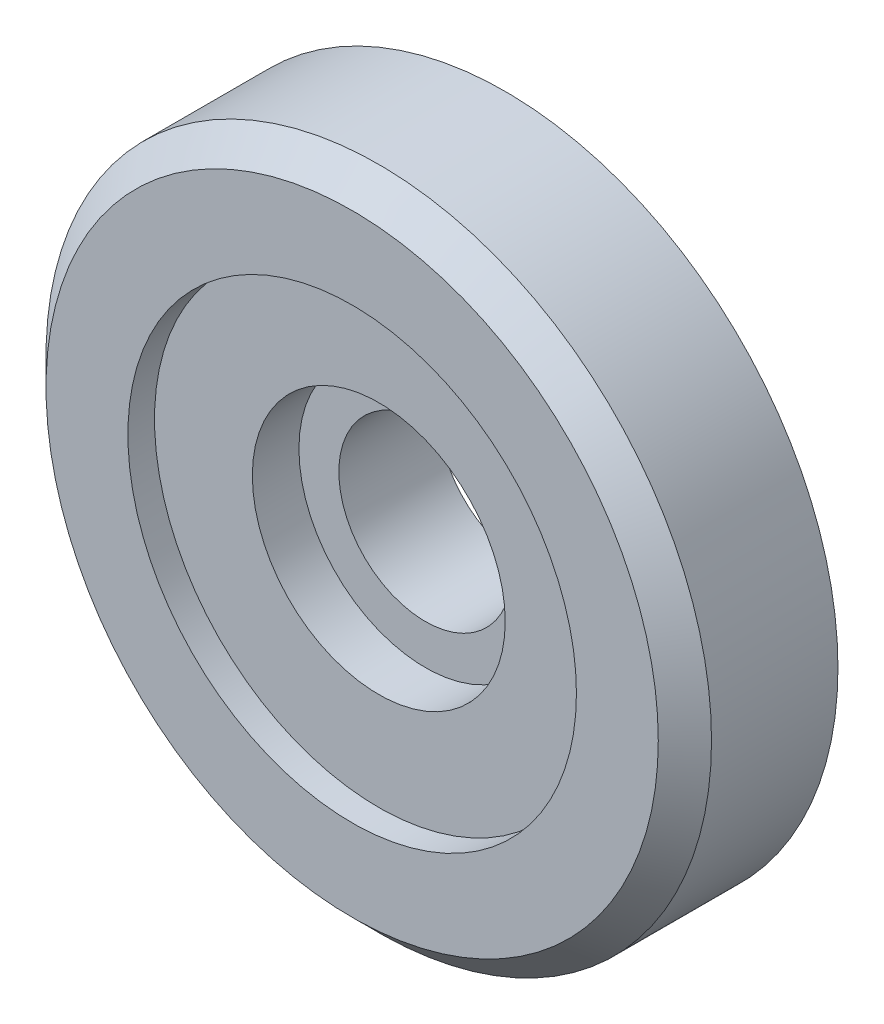
ISO-10303-21;
HEADER;
FILE_DESCRIPTION(('STEP AP214'),'2;1');
FILE_NAME('part.step','',(''),(''),'','','');
FILE_SCHEMA(('AUTOMOTIVE_DESIGN { 1 0 10303 214 1 1 1 1 }'));
ENDSEC;
DATA;
#1=APPLICATION_CONTEXT('core data for automotive mechanical design processes');
#2=APPLICATION_PROTOCOL_DEFINITION('international standard','automotive_design',2000,#1);
#3=PRODUCT_CONTEXT('',#1,'mechanical');
#4=PRODUCT('Part','Part','',(#3));
#5=PRODUCT_RELATED_PRODUCT_CATEGORY('part','',(#4));
#6=PRODUCT_DEFINITION_FORMATION('','',#4);
#7=PRODUCT_DEFINITION_CONTEXT('part definition',#1,'design');
#8=PRODUCT_DEFINITION('design','',#6,#7);
#9=PRODUCT_DEFINITION_SHAPE('','',#8);
#10=(LENGTH_UNIT() NAMED_UNIT(*) SI_UNIT(.MILLI.,.METRE.));
#11=(NAMED_UNIT(*) PLANE_ANGLE_UNIT() SI_UNIT($,.RADIAN.));
#12=(NAMED_UNIT(*) SI_UNIT($,.STERADIAN.) SOLID_ANGLE_UNIT());
#13=UNCERTAINTY_MEASURE_WITH_UNIT(LENGTH_MEASURE(1.E-05),#10,'distance_accuracy_value','');
#14=(GEOMETRIC_REPRESENTATION_CONTEXT(3) GLOBAL_UNCERTAINTY_ASSIGNED_CONTEXT((#13)) GLOBAL_UNIT_ASSIGNED_CONTEXT((#10,
#11,#12)) REPRESENTATION_CONTEXT('',''));
#15=CARTESIAN_POINT('',(0.,0.,0.));
#16=DIRECTION('',(0.,0.,1.));
#17=DIRECTION('',(1.,0.,0.));
#18=AXIS2_PLACEMENT_3D('',#15,#16,#17);
#19=CARTESIAN_POINT('',(0.,0.,-11.5));
#20=DIRECTION('',(0.,0.,1.));
#21=DIRECTION('',(1.,0.,0.));
#22=AXIS2_PLACEMENT_3D('',#19,#20,#21);
#23=PLANE('',#22);
#24=CARTESIAN_POINT('',(0.,0.,-11.5));
#25=DIRECTION('',(0.,0.,1.));
#26=DIRECTION('',(1.,0.,0.));
#27=AXIS2_PLACEMENT_3D('',#24,#25,#26);
#28=CIRCLE('',#27,25.);
#29=CARTESIAN_POINT('',(25.,0.,-11.5));
#30=VERTEX_POINT('',#29);
#31=EDGE_CURVE('E46',#30,#30,#28,.T.);
#32=ORIENTED_EDGE('',*,*,#31,.F.);
#33=EDGE_LOOP('',(#32));
#34=FACE_BOUND('',#33,.T.);
#35=CARTESIAN_POINT('',(0.,0.,-11.5));
#36=DIRECTION('',(0.,0.,1.));
#37=DIRECTION('',(1.,0.,0.));
#38=AXIS2_PLACEMENT_3D('',#35,#36,#37);
#39=CIRCLE('',#38,11.);
#40=CARTESIAN_POINT('',(11.,0.,-11.5));
#41=VERTEX_POINT('',#40);
#42=EDGE_CURVE('E42',#41,#41,#39,.F.);
#43=ORIENTED_EDGE('',*,*,#42,.F.);
#44=EDGE_LOOP('',(#43));
#45=FACE_BOUND('',#44,.T.);
#46=ADVANCED_FACE('F31',(#34,#45),#23,.F.);
#47=CARTESIAN_POINT('',(0.,0.,-11.5));
#48=DIRECTION('',(0.,0.,1.));
#49=DIRECTION('',(1.,0.,0.));
#50=AXIS2_PLACEMENT_3D('',#47,#48,#49);
#51=CYLINDRICAL_SURFACE('',#50,25.);
#52=CARTESIAN_POINT('',(0.,0.,-2.));
#53=DIRECTION('',(0.,0.,1.));
#54=DIRECTION('',(1.,0.,0.));
#55=AXIS2_PLACEMENT_3D('',#52,#53,#54);
#56=CIRCLE('',#55,25.);
#57=CARTESIAN_POINT('',(25.,0.,-2.));
#58=VERTEX_POINT('',#57);
#59=EDGE_CURVE('E10',#58,#58,#56,.F.);
#60=ORIENTED_EDGE('',*,*,#59,.T.);
#61=EDGE_LOOP('',(#60));
#62=FACE_BOUND('',#61,.T.);
#63=ORIENTED_EDGE('',*,*,#31,.T.);
#64=EDGE_LOOP('',(#63));
#65=FACE_BOUND('',#64,.T.);
#66=ADVANCED_FACE('F90',(#62,#65),#51,.T.);
#67=CARTESIAN_POINT('',(0.,0.,0.));
#68=DIRECTION('',(0.,0.,1.));
#69=DIRECTION('',(1.,0.,0.));
#70=AXIS2_PLACEMENT_3D('',#67,#68,#69);
#71=PLANE('',#70);
#72=CARTESIAN_POINT('',(0.,0.,0.));
#73=DIRECTION('',(0.,0.,1.));
#74=DIRECTION('',(1.,0.,0.));
#75=AXIS2_PLACEMENT_3D('',#72,#73,#74);
#76=CIRCLE('',#75,23.);
#77=CARTESIAN_POINT('',(23.,0.,0.));
#78=VERTEX_POINT('',#77);
#79=EDGE_CURVE('E38',#78,#78,#76,.T.);
#80=ORIENTED_EDGE('',*,*,#79,.T.);
#81=EDGE_LOOP('',(#80));
#82=FACE_BOUND('',#81,.T.);
#83=CARTESIAN_POINT('',(0.,0.,0.));
#84=DIRECTION('',(0.,0.,1.));
#85=DIRECTION('',(1.,0.,0.));
#86=AXIS2_PLACEMENT_3D('',#83,#84,#85);
#87=CIRCLE('',#86,16.85);
#88=CARTESIAN_POINT('',(16.85,0.,0.));
#89=VERTEX_POINT('',#88);
#90=EDGE_CURVE('E52',#89,#89,#87,.T.);
#91=ORIENTED_EDGE('',*,*,#90,.F.);
#92=EDGE_LOOP('',(#91));
#93=FACE_BOUND('',#92,.T.);
#94=ADVANCED_FACE('F96',(#82,#93),#71,.T.);
#95=CARTESIAN_POINT('',(0.,0.,-2.));
#96=DIRECTION('',(0.,0.,1.));
#97=DIRECTION('',(1.,0.,0.));
#98=AXIS2_PLACEMENT_3D('',#95,#96,#97);
#99=CYLINDRICAL_SURFACE('',#98,16.85);
#100=CARTESIAN_POINT('',(0.,0.,-2.));
#101=DIRECTION('',(0.,0.,1.));
#102=DIRECTION('',(1.,0.,0.));
#103=AXIS2_PLACEMENT_3D('',#100,#101,#102);
#104=CIRCLE('',#103,16.85);
#105=CARTESIAN_POINT('',(16.85,0.,-2.));
#106=VERTEX_POINT('',#105);
#107=EDGE_CURVE('E51',#106,#106,#104,.T.);
#108=ORIENTED_EDGE('',*,*,#107,.F.);
#109=EDGE_LOOP('',(#108));
#110=FACE_BOUND('',#109,.T.);
#111=ORIENTED_EDGE('',*,*,#90,.T.);
#112=EDGE_LOOP('',(#111));
#113=FACE_BOUND('',#112,.T.);
#114=ADVANCED_FACE('F101',(#110,#113),#99,.F.);
#115=CARTESIAN_POINT('',(0.,0.,-2.));
#116=DIRECTION('',(0.,0.,1.));
#117=DIRECTION('',(1.,0.,0.));
#118=AXIS2_PLACEMENT_3D('',#115,#116,#117);
#119=PLANE('',#118);
#120=CARTESIAN_POINT('',(0.,0.,-2.));
#121=DIRECTION('',(0.,0.,1.));
#122=DIRECTION('',(1.,0.,0.));
#123=AXIS2_PLACEMENT_3D('',#120,#121,#122);
#124=CIRCLE('',#123,9.5);
#125=CARTESIAN_POINT('',(9.5,0.,-2.));
#126=VERTEX_POINT('',#125);
#127=EDGE_CURVE('E58',#126,#126,#124,.T.);
#128=ORIENTED_EDGE('',*,*,#127,.F.);
#129=EDGE_LOOP('',(#128));
#130=FACE_BOUND('',#129,.T.);
#131=ORIENTED_EDGE('',*,*,#107,.T.);
#132=EDGE_LOOP('',(#131));
#133=FACE_BOUND('',#132,.T.);
#134=ADVANCED_FACE('F107',(#130,#133),#119,.T.);
#135=CARTESIAN_POINT('',(0.,0.,-5.5));
#136=DIRECTION('',(0.,0.,1.));
#137=DIRECTION('',(1.,0.,0.));
#138=AXIS2_PLACEMENT_3D('',#135,#136,#137);
#139=CYLINDRICAL_SURFACE('',#138,9.5);
#140=CARTESIAN_POINT('',(0.,0.,-5.5));
#141=DIRECTION('',(0.,0.,1.));
#142=DIRECTION('',(1.,0.,0.));
#143=AXIS2_PLACEMENT_3D('',#140,#141,#142);
#144=CIRCLE('',#143,9.5);
#145=CARTESIAN_POINT('',(9.5,0.,-5.5));
#146=VERTEX_POINT('',#145);
#147=EDGE_CURVE('E55',#146,#146,#144,.T.);
#148=ORIENTED_EDGE('',*,*,#147,.F.);
#149=EDGE_LOOP('',(#148));
#150=FACE_BOUND('',#149,.T.);
#151=ORIENTED_EDGE('',*,*,#127,.T.);
#152=EDGE_LOOP('',(#151));
#153=FACE_BOUND('',#152,.T.);
#154=ADVANCED_FACE('F115',(#150,#153),#139,.F.);
#155=CARTESIAN_POINT('',(0.,0.,-5.5));
#156=DIRECTION('',(0.,0.,1.));
#157=DIRECTION('',(1.,0.,0.));
#158=AXIS2_PLACEMENT_3D('',#155,#156,#157);
#159=PLANE('',#158);
#160=CARTESIAN_POINT('',(0.,0.,-5.5));
#161=DIRECTION('',(0.,0.,1.));
#162=DIRECTION('',(1.,0.,0.));
#163=AXIS2_PLACEMENT_3D('',#160,#161,#162);
#164=CIRCLE('',#163,6.5);
#165=CARTESIAN_POINT('',(6.5,0.,-5.5));
#166=VERTEX_POINT('',#165);
#167=EDGE_CURVE('E61',#166,#166,#164,.T.);
#168=ORIENTED_EDGE('',*,*,#167,.F.);
#169=EDGE_LOOP('',(#168));
#170=FACE_BOUND('',#169,.T.);
#171=ORIENTED_EDGE('',*,*,#147,.T.);
#172=EDGE_LOOP('',(#171));
#173=FACE_BOUND('',#172,.T.);
#174=ADVANCED_FACE('F86',(#170,#173),#159,.T.);
#175=CARTESIAN_POINT('',(0.,0.,-11.501));
#176=DIRECTION('',(0.,0.,1.));
#177=DIRECTION('',(1.,0.,0.));
#178=AXIS2_PLACEMENT_3D('',#175,#176,#177);
#179=CYLINDRICAL_SURFACE('',#178,6.5);
#180=ORIENTED_EDGE('',*,*,#167,.T.);
#181=EDGE_LOOP('',(#180));
#182=FACE_BOUND('',#181,.T.);
#183=CARTESIAN_POINT('',(0.,0.,-13.));
#184=DIRECTION('',(0.,0.,-1.));
#185=DIRECTION('',(-1.,0.,0.));
#186=AXIS2_PLACEMENT_3D('',#183,#184,#185);
#187=CIRCLE('',#186,6.5);
#188=CARTESIAN_POINT('',(-6.5,0.,-13.));
#189=VERTEX_POINT('',#188);
#190=EDGE_CURVE('E69',#189,#189,#187,.T.);
#191=ORIENTED_EDGE('',*,*,#190,.T.);
#192=EDGE_LOOP('',(#191));
#193=FACE_BOUND('',#192,.T.);
#194=ADVANCED_FACE('F73',(#182,#193),#179,.F.);
#195=CARTESIAN_POINT('',(0.,0.,-13.));
#196=DIRECTION('',(0.,0.,-1.));
#197=DIRECTION('',(-1.,0.,0.));
#198=AXIS2_PLACEMENT_3D('',#195,#196,#197);
#199=PLANE('',#198);
#200=CARTESIAN_POINT('',(0.,0.,-13.));
#201=DIRECTION('',(0.,0.,-1.));
#202=DIRECTION('',(-1.,0.,0.));
#203=AXIS2_PLACEMENT_3D('',#200,#201,#202);
#204=CIRCLE('',#203,11.);
#205=CARTESIAN_POINT('',(-11.,0.,-13.));
#206=VERTEX_POINT('',#205);
#207=EDGE_CURVE('E66',#206,#206,#204,.T.);
#208=ORIENTED_EDGE('',*,*,#207,.T.);
#209=EDGE_LOOP('',(#208));
#210=FACE_BOUND('',#209,.T.);
#211=ORIENTED_EDGE('',*,*,#190,.F.);
#212=EDGE_LOOP('',(#211));
#213=FACE_BOUND('',#212,.T.);
#214=ADVANCED_FACE('F75',(#210,#213),#199,.T.);
#215=CARTESIAN_POINT('',(0.,0.,-13.));
#216=DIRECTION('',(0.,0.,1.));
#217=DIRECTION('',(1.,0.,0.));
#218=AXIS2_PLACEMENT_3D('',#215,#216,#217);
#219=CYLINDRICAL_SURFACE('',#218,11.);
#220=ORIENTED_EDGE('',*,*,#207,.F.);
#221=EDGE_LOOP('',(#220));
#222=FACE_BOUND('',#221,.T.);
#223=ORIENTED_EDGE('',*,*,#42,.T.);
#224=EDGE_LOOP('',(#223));
#225=FACE_BOUND('',#224,.T.);
#226=ADVANCED_FACE('F77',(#222,#225),#219,.T.);
#227=CARTESIAN_POINT('',(0.,0.,0.));
#228=DIRECTION('',(0.,0.,-1.));
#229=DIRECTION('',(-1.,0.,0.));
#230=AXIS2_PLACEMENT_3D('',#227,#228,#229);
#231=CONICAL_SURFACE('',#230,23.,0.785398163397447);
#232=ORIENTED_EDGE('',*,*,#59,.F.);
#233=EDGE_LOOP('',(#232));
#234=FACE_BOUND('',#233,.T.);
#235=ORIENTED_EDGE('',*,*,#79,.F.);
#236=EDGE_LOOP('',(#235));
#237=FACE_BOUND('',#236,.T.);
#238=ADVANCED_FACE('F33',(#234,#237),#231,.T.);
#239=CLOSED_SHELL('',(#46,#66,#94,#114,#134,#154,#174,#194,#214,#226,#238));
#240=MANIFOLD_SOLID_BREP('B2',#239);
#241=ADVANCED_BREP_SHAPE_REPRESENTATION('',(#18,#240),#14);
#242=SHAPE_DEFINITION_REPRESENTATION(#9,#241);
ENDSEC;
END-ISO-10303-21;
